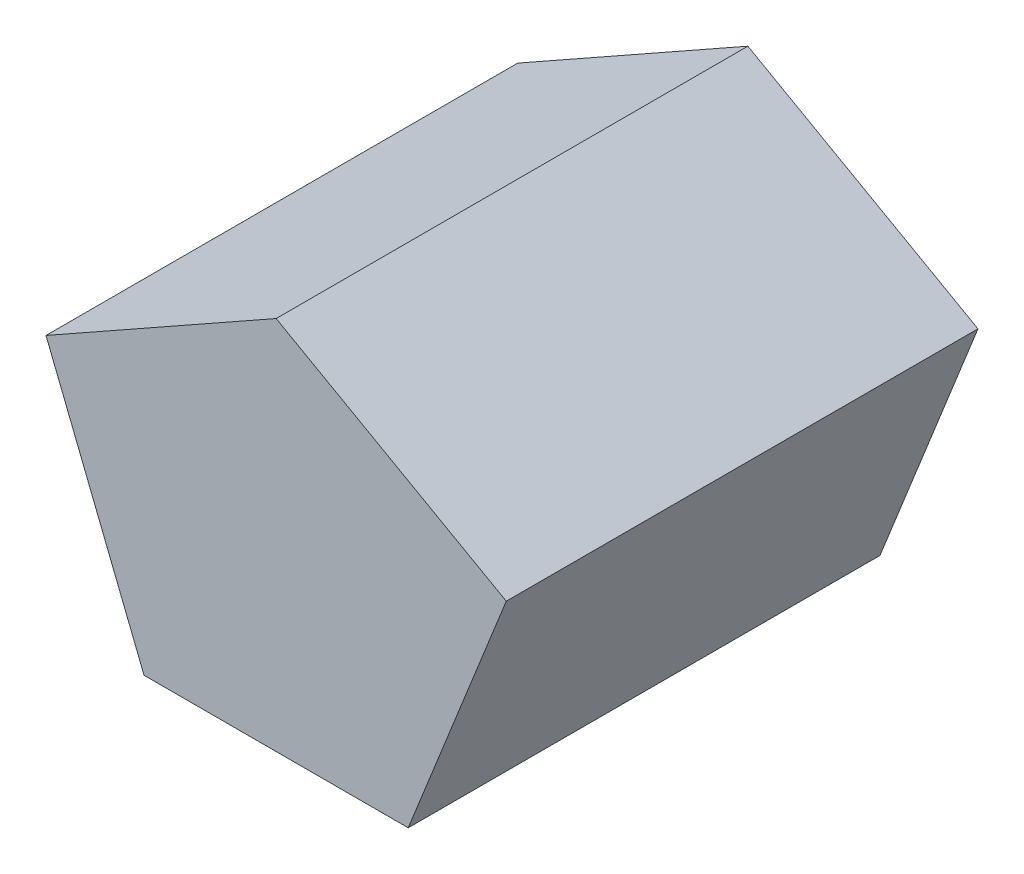
ISO-10303-21;
HEADER;
FILE_DESCRIPTION(('STEP AP214'),'2;1');
FILE_NAME('part.step','',(''),(''),'','','');
FILE_SCHEMA(('AUTOMOTIVE_DESIGN { 1 0 10303 214 1 1 1 1 }'));
ENDSEC;
DATA;
#1=APPLICATION_CONTEXT('core data for automotive mechanical design processes');
#2=APPLICATION_PROTOCOL_DEFINITION('international standard','automotive_design',2000,#1);
#3=PRODUCT_CONTEXT('',#1,'mechanical');
#4=PRODUCT('Part','Part','',(#3));
#5=PRODUCT_RELATED_PRODUCT_CATEGORY('part','',(#4));
#6=PRODUCT_DEFINITION_FORMATION('','',#4);
#7=PRODUCT_DEFINITION_CONTEXT('part definition',#1,'design');
#8=PRODUCT_DEFINITION('design','',#6,#7);
#9=PRODUCT_DEFINITION_SHAPE('','',#8);
#10=(LENGTH_UNIT() NAMED_UNIT(*) SI_UNIT(.MILLI.,.METRE.));
#11=(NAMED_UNIT(*) PLANE_ANGLE_UNIT() SI_UNIT($,.RADIAN.));
#12=(NAMED_UNIT(*) SI_UNIT($,.STERADIAN.) SOLID_ANGLE_UNIT());
#13=UNCERTAINTY_MEASURE_WITH_UNIT(LENGTH_MEASURE(1.E-05),#10,'distance_accuracy_value','');
#14=(GEOMETRIC_REPRESENTATION_CONTEXT(3) GLOBAL_UNCERTAINTY_ASSIGNED_CONTEXT((#13)) GLOBAL_UNIT_ASSIGNED_CONTEXT((#10,
#11,#12)) REPRESENTATION_CONTEXT('',''));
#15=CARTESIAN_POINT('',(0.,0.,0.));
#16=DIRECTION('',(0.,0.,1.));
#17=DIRECTION('',(1.,0.,0.));
#18=AXIS2_PLACEMENT_3D('',#15,#16,#17);
#19=CARTESIAN_POINT('',(24.7629370442332,17.5723057773458,50.));
#20=DIRECTION('',(-0.491010339483945,-0.871153744479045,0.));
#21=DIRECTION('',(0.871153744479045,-0.491010339483945,0.));
#22=AXIS2_PLACEMENT_3D('',#19,#20,#21);
#23=PLANE('',#22);
#24=DIRECTION('',(-0.871153744479045,0.491010339483945,0.));
#25=VECTOR('',#24,1.);
#26=CARTESIAN_POINT('',(24.7629370442332,17.5723057773458,0.));
#27=LINE('',#26,#25);
#28=CARTESIAN_POINT('',(24.7629370442332,17.5723057773458,0.));
#29=VERTEX_POINT('',#28);
#30=CARTESIAN_POINT('',(0.370632198819949,31.3205952828963,0.));
#31=VERTEX_POINT('',#30);
#32=EDGE_CURVE('E107',#29,#31,#27,.T.);
#33=ORIENTED_EDGE('',*,*,#32,.T.);
#34=DIRECTION('',(0.,0.,-1.));
#35=VECTOR('',#34,1.);
#36=CARTESIAN_POINT('',(0.370632198819949,31.3205952828963,50.));
#37=LINE('',#36,#35);
#38=CARTESIAN_POINT('',(0.370632198819949,31.3205952828963,50.));
#39=VERTEX_POINT('',#38);
#40=EDGE_CURVE('E11',#39,#31,#37,.T.);
#41=ORIENTED_EDGE('',*,*,#40,.F.);
#42=DIRECTION('',(-0.871153744479045,0.491010339483945,0.));
#43=VECTOR('',#42,1.);
#44=CARTESIAN_POINT('',(24.7629370442332,17.5723057773458,50.));
#45=LINE('',#44,#43);
#46=CARTESIAN_POINT('',(24.7629370442332,17.5723057773458,50.));
#47=VERTEX_POINT('',#46);
#48=EDGE_CURVE('E116',#47,#39,#45,.T.);
#49=ORIENTED_EDGE('',*,*,#48,.F.);
#50=DIRECTION('',(0.,0.,-1.));
#51=VECTOR('',#50,1.);
#52=CARTESIAN_POINT('',(24.7629370442332,17.5723057773458,50.));
#53=LINE('',#52,#51);
#54=EDGE_CURVE('E103',#47,#29,#53,.T.);
#55=ORIENTED_EDGE('',*,*,#54,.T.);
#56=EDGE_LOOP('',(#33,#41,#49,#55));
#57=FACE_BOUND('',#56,.T.);
#58=ADVANCED_FACE('F33',(#57),#23,.F.);
#59=CARTESIAN_POINT('',(0.370632198819949,31.3205952828963,50.));
#60=DIRECTION('',(0.491010339483945,-0.871153744479045,0.));
#61=DIRECTION('',(0.871153744479045,0.491010339483945,0.));
#62=AXIS2_PLACEMENT_3D('',#59,#60,#61);
#63=PLANE('',#62);
#64=DIRECTION('',(-0.871153744479045,-0.491010339483945,0.));
#65=VECTOR('',#64,1.);
#66=CARTESIAN_POINT('',(0.370632198819949,31.3205952828963,0.));
#67=LINE('',#66,#65);
#68=CARTESIAN_POINT('',(-24.0216726465933,17.5723057773458,0.));
#69=VERTEX_POINT('',#68);
#70=EDGE_CURVE('E110',#31,#69,#67,.T.);
#71=ORIENTED_EDGE('',*,*,#70,.T.);
#72=DIRECTION('',(0.,0.,-1.));
#73=VECTOR('',#72,1.);
#74=CARTESIAN_POINT('',(-24.0216726465933,17.5723057773458,50.));
#75=LINE('',#74,#73);
#76=CARTESIAN_POINT('',(-24.0216726465933,17.5723057773458,50.));
#77=VERTEX_POINT('',#76);
#78=EDGE_CURVE('E41',#77,#69,#75,.T.);
#79=ORIENTED_EDGE('',*,*,#78,.F.);
#80=DIRECTION('',(-0.871153744479045,-0.491010339483945,0.));
#81=VECTOR('',#80,1.);
#82=CARTESIAN_POINT('',(0.370632198819949,31.3205952828963,50.));
#83=LINE('',#82,#81);
#84=EDGE_CURVE('E83',#39,#77,#83,.T.);
#85=ORIENTED_EDGE('',*,*,#84,.F.);
#86=ORIENTED_EDGE('',*,*,#40,.T.);
#87=EDGE_LOOP('',(#71,#79,#85,#86));
#88=FACE_BOUND('',#87,.T.);
#89=ADVANCED_FACE('F135',(#88),#63,.F.);
#90=CARTESIAN_POINT('',(-24.0216726465933,17.5723057773458,50.));
#91=DIRECTION('',(0.928571428571429,0.371153744479045,0.));
#92=DIRECTION('',(-0.371153744479045,0.928571428571429,0.));
#93=AXIS2_PLACEMENT_3D('',#90,#91,#92);
#94=PLANE('',#93);
#95=DIRECTION('',(0.371153744479045,-0.928571428571429,0.));
#96=VECTOR('',#95,1.);
#97=CARTESIAN_POINT('',(-24.0216726465933,17.5723057773458,0.));
#98=LINE('',#97,#96);
#99=CARTESIAN_POINT('',(-13.62936780118,-8.42769422265417,0.));
#100=VERTEX_POINT('',#99);
#101=EDGE_CURVE('E98',#69,#100,#98,.T.);
#102=ORIENTED_EDGE('',*,*,#101,.T.);
#103=DIRECTION('',(0.,0.,-1.));
#104=VECTOR('',#103,1.);
#105=CARTESIAN_POINT('',(-13.62936780118,-8.42769422265417,50.));
#106=LINE('',#105,#104);
#107=CARTESIAN_POINT('',(-13.62936780118,-8.42769422265417,50.));
#108=VERTEX_POINT('',#107);
#109=EDGE_CURVE('E95',#108,#100,#106,.T.);
#110=ORIENTED_EDGE('',*,*,#109,.F.);
#111=DIRECTION('',(0.371153744479045,-0.928571428571429,0.));
#112=VECTOR('',#111,1.);
#113=CARTESIAN_POINT('',(-24.0216726465933,17.5723057773458,50.));
#114=LINE('',#113,#112);
#115=EDGE_CURVE('E87',#77,#108,#114,.T.);
#116=ORIENTED_EDGE('',*,*,#115,.F.);
#117=ORIENTED_EDGE('',*,*,#78,.T.);
#118=EDGE_LOOP('',(#102,#110,#116,#117));
#119=FACE_BOUND('',#118,.T.);
#120=ADVANCED_FACE('F96',(#119),#94,.F.);
#121=CARTESIAN_POINT('',(-13.62936780118,-8.42769422265417,50.));
#122=DIRECTION('',(0.,1.,0.));
#123=DIRECTION('',(0.,0.,1.));
#124=AXIS2_PLACEMENT_3D('',#121,#122,#123);
#125=PLANE('',#124);
#126=DIRECTION('',(1.,0.,0.));
#127=VECTOR('',#126,1.);
#128=CARTESIAN_POINT('',(-13.62936780118,-8.42769422265417,0.));
#129=LINE('',#128,#127);
#130=CARTESIAN_POINT('',(14.3706321988199,-8.42769422265417,0.));
#131=VERTEX_POINT('',#130);
#132=EDGE_CURVE('E69',#100,#131,#129,.T.);
#133=ORIENTED_EDGE('',*,*,#132,.T.);
#134=DIRECTION('',(0.,0.,-1.));
#135=VECTOR('',#134,1.);
#136=CARTESIAN_POINT('',(14.3706321988199,-8.42769422265417,50.));
#137=LINE('',#136,#135);
#138=CARTESIAN_POINT('',(14.3706321988199,-8.42769422265417,50.));
#139=VERTEX_POINT('',#138);
#140=EDGE_CURVE('E99',#139,#131,#137,.T.);
#141=ORIENTED_EDGE('',*,*,#140,.F.);
#142=DIRECTION('',(1.,0.,0.));
#143=VECTOR('',#142,1.);
#144=CARTESIAN_POINT('',(-13.62936780118,-8.42769422265417,50.));
#145=LINE('',#144,#143);
#146=EDGE_CURVE('E91',#108,#139,#145,.T.);
#147=ORIENTED_EDGE('',*,*,#146,.F.);
#148=ORIENTED_EDGE('',*,*,#109,.T.);
#149=EDGE_LOOP('',(#133,#141,#147,#148));
#150=FACE_BOUND('',#149,.T.);
#151=ADVANCED_FACE('F101',(#150),#125,.F.);
#152=CARTESIAN_POINT('',(14.3706321988199,-8.42769422265417,50.));
#153=DIRECTION('',(-0.928571428571429,0.371153744479045,0.));
#154=DIRECTION('',(-0.371153744479045,-0.928571428571429,0.));
#155=AXIS2_PLACEMENT_3D('',#152,#153,#154);
#156=PLANE('',#155);
#157=DIRECTION('',(0.371153744479045,0.928571428571429,0.));
#158=VECTOR('',#157,1.);
#159=CARTESIAN_POINT('',(14.3706321988199,-8.42769422265417,0.));
#160=LINE('',#159,#158);
#161=EDGE_CURVE('E75',#131,#29,#160,.T.);
#162=ORIENTED_EDGE('',*,*,#161,.T.);
#163=ORIENTED_EDGE('',*,*,#54,.F.);
#164=DIRECTION('',(0.371153744479045,0.928571428571429,0.));
#165=VECTOR('',#164,1.);
#166=CARTESIAN_POINT('',(14.3706321988199,-8.42769422265417,50.));
#167=LINE('',#166,#165);
#168=EDGE_CURVE('E49',#139,#47,#167,.T.);
#169=ORIENTED_EDGE('',*,*,#168,.F.);
#170=ORIENTED_EDGE('',*,*,#140,.T.);
#171=EDGE_LOOP('',(#162,#163,#169,#170));
#172=FACE_BOUND('',#171,.T.);
#173=ADVANCED_FACE('F124',(#172),#156,.F.);
#174=CARTESIAN_POINT('',(0.,0.,50.));
#175=DIRECTION('',(0.,0.,-1.));
#176=DIRECTION('',(-1.,0.,0.));
#177=AXIS2_PLACEMENT_3D('',#174,#175,#176);
#178=PLANE('',#177);
#179=ORIENTED_EDGE('',*,*,#48,.T.);
#180=ORIENTED_EDGE('',*,*,#84,.T.);
#181=ORIENTED_EDGE('',*,*,#115,.T.);
#182=ORIENTED_EDGE('',*,*,#146,.T.);
#183=ORIENTED_EDGE('',*,*,#168,.T.);
#184=EDGE_LOOP('',(#179,#180,#181,#182,#183));
#185=FACE_BOUND('',#184,.T.);
#186=ADVANCED_FACE('F89',(#185),#178,.F.);
#187=CARTESIAN_POINT('',(0.,0.,0.));
#188=DIRECTION('',(0.,0.,-1.));
#189=DIRECTION('',(-1.,0.,0.));
#190=AXIS2_PLACEMENT_3D('',#187,#188,#189);
#191=PLANE('',#190);
#192=CARTESIAN_POINT('',(0.,6.62048649111746,0.));
#193=DIRECTION('',(0.,0.,-1.));
#194=DIRECTION('',(-1.,0.,0.));
#195=AXIS2_PLACEMENT_3D('',#192,#193,#194);
#196=CIRCLE('',#195,5.);
#197=CARTESIAN_POINT('',(-5.,6.62048649111746,0.));
#198=VERTEX_POINT('',#197);
#199=EDGE_CURVE('E193',#198,#198,#196,.T.);
#200=ORIENTED_EDGE('',*,*,#199,.F.);
#201=EDGE_LOOP('',(#200));
#202=FACE_BOUND('',#201,.T.);
#203=ORIENTED_EDGE('',*,*,#32,.F.);
#204=ORIENTED_EDGE('',*,*,#161,.F.);
#205=ORIENTED_EDGE('',*,*,#132,.F.);
#206=ORIENTED_EDGE('',*,*,#101,.F.);
#207=ORIENTED_EDGE('',*,*,#70,.F.);
#208=EDGE_LOOP('',(#203,#204,#205,#206,#207));
#209=FACE_BOUND('',#208,.T.);
#210=ADVANCED_FACE('F120',(#202,#209),#191,.T.);
#211=CARTESIAN_POINT('',(0.,6.62048649111746,10.));
#212=DIRECTION('',(0.,0.,-1.));
#213=DIRECTION('',(-1.,0.,0.));
#214=AXIS2_PLACEMENT_3D('',#211,#212,#213);
#215=CYLINDRICAL_SURFACE('',#214,5.);
#216=CARTESIAN_POINT('',(0.,6.62048649111746,10.));
#217=DIRECTION('',(0.,0.,-1.));
#218=DIRECTION('',(-1.,0.,0.));
#219=AXIS2_PLACEMENT_3D('',#216,#217,#218);
#220=CIRCLE('',#219,5.);
#221=CARTESIAN_POINT('',(-5.,6.62048649111746,10.));
#222=VERTEX_POINT('',#221);
#223=EDGE_CURVE('E111',#222,#222,#220,.T.);
#224=ORIENTED_EDGE('',*,*,#223,.F.);
#225=EDGE_LOOP('',(#224));
#226=FACE_BOUND('',#225,.T.);
#227=ORIENTED_EDGE('',*,*,#199,.T.);
#228=EDGE_LOOP('',(#227));
#229=FACE_BOUND('',#228,.T.);
#230=ADVANCED_FACE('F168',(#226,#229),#215,.F.);
#231=CARTESIAN_POINT('',(0.,6.62048649111746,10.));
#232=DIRECTION('',(0.,0.,-1.));
#233=DIRECTION('',(-1.,0.,0.));
#234=AXIS2_PLACEMENT_3D('',#231,#232,#233);
#235=PLANE('',#234);
#236=ORIENTED_EDGE('',*,*,#223,.T.);
#237=EDGE_LOOP('',(#236));
#238=FACE_BOUND('',#237,.T.);
#239=ADVANCED_FACE('F177',(#238),#235,.T.);
#240=CLOSED_SHELL('',(#58,#89,#120,#151,#173,#186,#210,#230,#239));
#241=MANIFOLD_SOLID_BREP('B2',#240);
#242=ADVANCED_BREP_SHAPE_REPRESENTATION('',(#18,#241),#14);
#243=SHAPE_DEFINITION_REPRESENTATION(#9,#242);
ENDSEC;
END-ISO-10303-21;
